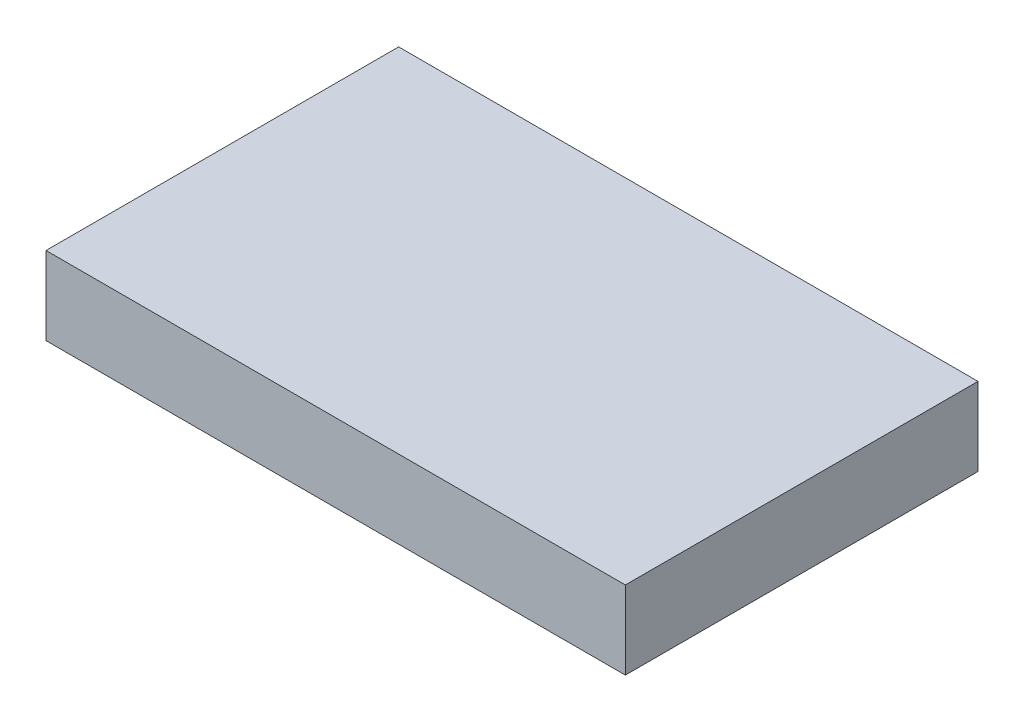
ISO-10303-21;
HEADER;
FILE_DESCRIPTION(('STEP AP214'),'2;1');
FILE_NAME('part.step','',(''),(''),'','','');
FILE_SCHEMA(('AUTOMOTIVE_DESIGN { 1 0 10303 214 1 1 1 1 }'));
ENDSEC;
DATA;
#1=APPLICATION_CONTEXT('core data for automotive mechanical design processes');
#2=APPLICATION_PROTOCOL_DEFINITION('international standard','automotive_design',2000,#1);
#3=PRODUCT_CONTEXT('',#1,'mechanical');
#4=PRODUCT('Part','Part','',(#3));
#5=PRODUCT_RELATED_PRODUCT_CATEGORY('part','',(#4));
#6=PRODUCT_DEFINITION_FORMATION('','',#4);
#7=PRODUCT_DEFINITION_CONTEXT('part definition',#1,'design');
#8=PRODUCT_DEFINITION('design','',#6,#7);
#9=PRODUCT_DEFINITION_SHAPE('','',#8);
#10=(LENGTH_UNIT() NAMED_UNIT(*) SI_UNIT(.MILLI.,.METRE.));
#11=(NAMED_UNIT(*) PLANE_ANGLE_UNIT() SI_UNIT($,.RADIAN.));
#12=(NAMED_UNIT(*) SI_UNIT($,.STERADIAN.) SOLID_ANGLE_UNIT());
#13=UNCERTAINTY_MEASURE_WITH_UNIT(LENGTH_MEASURE(1.E-05),#10,'distance_accuracy_value','');
#14=(GEOMETRIC_REPRESENTATION_CONTEXT(3) GLOBAL_UNCERTAINTY_ASSIGNED_CONTEXT((#13)) GLOBAL_UNIT_ASSIGNED_CONTEXT((#10,
#11,#12)) REPRESENTATION_CONTEXT('',''));
#15=CARTESIAN_POINT('',(0.,0.,0.));
#16=DIRECTION('',(0.,0.,1.));
#17=DIRECTION('',(1.,0.,0.));
#18=AXIS2_PLACEMENT_3D('',#15,#16,#17);
#19=CARTESIAN_POINT('',(-57.5,15.5,-35.01));
#20=DIRECTION('',(0.,-1.,0.));
#21=DIRECTION('',(0.,0.,-1.));
#22=AXIS2_PLACEMENT_3D('',#19,#20,#21);
#23=PLANE('',#22);
#24=DIRECTION('',(0.,0.,-1.));
#25=VECTOR('',#24,1.);
#26=CARTESIAN_POINT('',(-54.5,15.5,-35.));
#27=LINE('',#26,#25);
#28=CARTESIAN_POINT('',(-54.5,15.5,32.));
#29=VERTEX_POINT('',#28);
#30=CARTESIAN_POINT('',(-54.5,15.5,-32.));
#31=VERTEX_POINT('',#30);
#32=EDGE_CURVE('E132',#29,#31,#27,.T.);
#33=ORIENTED_EDGE('',*,*,#32,.F.);
#34=DIRECTION('',(-1.,0.,0.));
#35=VECTOR('',#34,1.);
#36=CARTESIAN_POINT('',(-57.5,15.5,32.));
#37=LINE('',#36,#35);
#38=CARTESIAN_POINT('',(54.5,15.5,32.));
#39=VERTEX_POINT('',#38);
#40=EDGE_CURVE('E129',#39,#29,#37,.T.);
#41=ORIENTED_EDGE('',*,*,#40,.F.);
#42=DIRECTION('',(0.,0.,1.));
#43=VECTOR('',#42,1.);
#44=CARTESIAN_POINT('',(54.5,15.5,-35.));
#45=LINE('',#44,#43);
#46=CARTESIAN_POINT('',(54.5,15.5,-32.));
#47=VERTEX_POINT('',#46);
#48=EDGE_CURVE('E50',#47,#39,#45,.T.);
#49=ORIENTED_EDGE('',*,*,#48,.F.);
#50=DIRECTION('',(1.,0.,0.));
#51=VECTOR('',#50,1.);
#52=CARTESIAN_POINT('',(-57.5,15.5,-32.));
#53=LINE('',#52,#51);
#54=EDGE_CURVE('E117',#31,#47,#53,.T.);
#55=ORIENTED_EDGE('',*,*,#54,.F.);
#56=EDGE_LOOP('',(#33,#41,#49,#55));
#57=FACE_BOUND('',#56,.T.);
#58=DIRECTION('',(0.,0.,-1.));
#59=VECTOR('',#58,1.);
#60=CARTESIAN_POINT('',(-57.5,15.5,-35.));
#61=LINE('',#60,#59);
#62=CARTESIAN_POINT('',(-57.5,15.5,35.));
#63=VERTEX_POINT('',#62);
#64=CARTESIAN_POINT('',(-57.5,15.5,-35.));
#65=VERTEX_POINT('',#64);
#66=EDGE_CURVE('E148',#63,#65,#61,.T.);
#67=ORIENTED_EDGE('',*,*,#66,.T.);
#68=DIRECTION('',(1.,0.,0.));
#69=VECTOR('',#68,1.);
#70=CARTESIAN_POINT('',(-57.5,15.5,-35.));
#71=LINE('',#70,#69);
#72=CARTESIAN_POINT('',(57.5,15.5,-35.));
#73=VERTEX_POINT('',#72);
#74=EDGE_CURVE('E145',#65,#73,#71,.T.);
#75=ORIENTED_EDGE('',*,*,#74,.T.);
#76=DIRECTION('',(0.,0.,1.));
#77=VECTOR('',#76,1.);
#78=CARTESIAN_POINT('',(57.5,15.5,-35.));
#79=LINE('',#78,#77);
#80=CARTESIAN_POINT('',(57.5,15.5,35.));
#81=VERTEX_POINT('',#80);
#82=EDGE_CURVE('E141',#73,#81,#79,.T.);
#83=ORIENTED_EDGE('',*,*,#82,.T.);
#84=DIRECTION('',(-1.,0.,0.));
#85=VECTOR('',#84,1.);
#86=CARTESIAN_POINT('',(-57.5,15.5,35.));
#87=LINE('',#86,#85);
#88=EDGE_CURVE('E113',#81,#63,#87,.T.);
#89=ORIENTED_EDGE('',*,*,#88,.T.);
#90=EDGE_LOOP('',(#67,#75,#83,#89));
#91=FACE_BOUND('',#90,.T.);
#92=ADVANCED_FACE('F33',(#57,#91),#23,.T.);
#93=CARTESIAN_POINT('',(57.5,31.,-35.));
#94=DIRECTION('',(-1.,0.,0.));
#95=DIRECTION('',(0.,0.,1.));
#96=AXIS2_PLACEMENT_3D('',#93,#94,#95);
#97=PLANE('',#96);
#98=ORIENTED_EDGE('',*,*,#82,.F.);
#99=DIRECTION('',(0.,-1.,0.));
#100=VECTOR('',#99,1.);
#101=CARTESIAN_POINT('',(57.5,31.,-35.));
#102=LINE('',#101,#100);
#103=CARTESIAN_POINT('',(57.5,31.,-35.));
#104=VERTEX_POINT('',#103);
#105=EDGE_CURVE('E144',#104,#73,#102,.T.);
#106=ORIENTED_EDGE('',*,*,#105,.F.);
#107=DIRECTION('',(0.,0.,-1.));
#108=VECTOR('',#107,1.);
#109=CARTESIAN_POINT('',(57.5,31.,-35.));
#110=LINE('',#109,#108);
#111=CARTESIAN_POINT('',(57.5,31.,35.));
#112=VERTEX_POINT('',#111);
#113=EDGE_CURVE('E11',#112,#104,#110,.T.);
#114=ORIENTED_EDGE('',*,*,#113,.F.);
#115=DIRECTION('',(0.,-1.,0.));
#116=VECTOR('',#115,1.);
#117=CARTESIAN_POINT('',(57.5,31.,35.));
#118=LINE('',#117,#116);
#119=EDGE_CURVE('E37',#112,#81,#118,.T.);
#120=ORIENTED_EDGE('',*,*,#119,.T.);
#121=EDGE_LOOP('',(#98,#106,#114,#120));
#122=FACE_BOUND('',#121,.T.);
#123=ADVANCED_FACE('F165',(#122),#97,.F.);
#124=CARTESIAN_POINT('',(-57.5,31.,-35.));
#125=DIRECTION('',(0.,0.,1.));
#126=DIRECTION('',(1.,0.,0.));
#127=AXIS2_PLACEMENT_3D('',#124,#125,#126);
#128=PLANE('',#127);
#129=ORIENTED_EDGE('',*,*,#74,.F.);
#130=DIRECTION('',(0.,-1.,0.));
#131=VECTOR('',#130,1.);
#132=CARTESIAN_POINT('',(-57.5,31.,-35.));
#133=LINE('',#132,#131);
#134=CARTESIAN_POINT('',(-57.5,31.,-35.));
#135=VERTEX_POINT('',#134);
#136=EDGE_CURVE('E154',#135,#65,#133,.T.);
#137=ORIENTED_EDGE('',*,*,#136,.F.);
#138=DIRECTION('',(-1.,0.,0.));
#139=VECTOR('',#138,1.);
#140=CARTESIAN_POINT('',(-57.5,31.,-35.));
#141=LINE('',#140,#139);
#142=EDGE_CURVE('E42',#104,#135,#141,.T.);
#143=ORIENTED_EDGE('',*,*,#142,.F.);
#144=ORIENTED_EDGE('',*,*,#105,.T.);
#145=EDGE_LOOP('',(#129,#137,#143,#144));
#146=FACE_BOUND('',#145,.T.);
#147=ADVANCED_FACE('F178',(#146),#128,.F.);
#148=CARTESIAN_POINT('',(-57.5,31.,-35.));
#149=DIRECTION('',(1.,0.,0.));
#150=DIRECTION('',(0.,0.,-1.));
#151=AXIS2_PLACEMENT_3D('',#148,#149,#150);
#152=PLANE('',#151);
#153=ORIENTED_EDGE('',*,*,#66,.F.);
#154=DIRECTION('',(0.,-1.,0.));
#155=VECTOR('',#154,1.);
#156=CARTESIAN_POINT('',(-57.5,31.,35.));
#157=LINE('',#156,#155);
#158=CARTESIAN_POINT('',(-57.5,31.,35.));
#159=VERTEX_POINT('',#158);
#160=EDGE_CURVE('E155',#159,#63,#157,.T.);
#161=ORIENTED_EDGE('',*,*,#160,.F.);
#162=DIRECTION('',(0.,0.,1.));
#163=VECTOR('',#162,1.);
#164=CARTESIAN_POINT('',(-57.5,31.,-35.));
#165=LINE('',#164,#163);
#166=EDGE_CURVE('E138',#135,#159,#165,.T.);
#167=ORIENTED_EDGE('',*,*,#166,.F.);
#168=ORIENTED_EDGE('',*,*,#136,.T.);
#169=EDGE_LOOP('',(#153,#161,#167,#168));
#170=FACE_BOUND('',#169,.T.);
#171=ADVANCED_FACE('F171',(#170),#152,.F.);
#172=CARTESIAN_POINT('',(-57.5,31.,35.));
#173=DIRECTION('',(0.,0.,-1.));
#174=DIRECTION('',(-1.,0.,0.));
#175=AXIS2_PLACEMENT_3D('',#172,#173,#174);
#176=PLANE('',#175);
#177=ORIENTED_EDGE('',*,*,#88,.F.);
#178=ORIENTED_EDGE('',*,*,#119,.F.);
#179=DIRECTION('',(1.,0.,0.));
#180=VECTOR('',#179,1.);
#181=CARTESIAN_POINT('',(-57.5,31.,35.));
#182=LINE('',#181,#180);
#183=EDGE_CURVE('E136',#159,#112,#182,.T.);
#184=ORIENTED_EDGE('',*,*,#183,.F.);
#185=ORIENTED_EDGE('',*,*,#160,.T.);
#186=EDGE_LOOP('',(#177,#178,#184,#185));
#187=FACE_BOUND('',#186,.T.);
#188=ADVANCED_FACE('F35',(#187),#176,.F.);
#189=CARTESIAN_POINT('',(0.,31.,0.));
#190=DIRECTION('',(0.,1.,0.));
#191=DIRECTION('',(0.,0.,1.));
#192=AXIS2_PLACEMENT_3D('',#189,#190,#191);
#193=PLANE('',#192);
#194=ORIENTED_EDGE('',*,*,#113,.T.);
#195=ORIENTED_EDGE('',*,*,#142,.T.);
#196=ORIENTED_EDGE('',*,*,#166,.T.);
#197=ORIENTED_EDGE('',*,*,#183,.T.);
#198=EDGE_LOOP('',(#194,#195,#196,#197));
#199=FACE_BOUND('',#198,.T.);
#200=ADVANCED_FACE('F170',(#199),#193,.T.);
#201=CARTESIAN_POINT('',(54.5,31.,-35.));
#202=DIRECTION('',(-1.,0.,0.));
#203=DIRECTION('',(0.,0.,1.));
#204=AXIS2_PLACEMENT_3D('',#201,#202,#203);
#205=PLANE('',#204);
#206=ORIENTED_EDGE('',*,*,#48,.T.);
#207=DIRECTION('',(0.,-1.,0.));
#208=VECTOR('',#207,1.);
#209=CARTESIAN_POINT('',(54.5,31.,32.));
#210=LINE('',#209,#208);
#211=CARTESIAN_POINT('',(54.5,28.,32.));
#212=VERTEX_POINT('',#211);
#213=EDGE_CURVE('E112',#212,#39,#210,.T.);
#214=ORIENTED_EDGE('',*,*,#213,.F.);
#215=DIRECTION('',(0.,0.,-1.));
#216=VECTOR('',#215,1.);
#217=CARTESIAN_POINT('',(54.5,28.,-35.));
#218=LINE('',#217,#216);
#219=CARTESIAN_POINT('',(54.5,28.,-32.));
#220=VERTEX_POINT('',#219);
#221=EDGE_CURVE('E103',#212,#220,#218,.T.);
#222=ORIENTED_EDGE('',*,*,#221,.T.);
#223=DIRECTION('',(0.,-1.,0.));
#224=VECTOR('',#223,1.);
#225=CARTESIAN_POINT('',(54.5,31.,-32.));
#226=LINE('',#225,#224);
#227=EDGE_CURVE('E110',#220,#47,#226,.T.);
#228=ORIENTED_EDGE('',*,*,#227,.T.);
#229=EDGE_LOOP('',(#206,#214,#222,#228));
#230=FACE_BOUND('',#229,.T.);
#231=ADVANCED_FACE('F109',(#230),#205,.T.);
#232=CARTESIAN_POINT('',(-57.5,31.,-32.));
#233=DIRECTION('',(0.,0.,1.));
#234=DIRECTION('',(1.,0.,0.));
#235=AXIS2_PLACEMENT_3D('',#232,#233,#234);
#236=PLANE('',#235);
#237=ORIENTED_EDGE('',*,*,#54,.T.);
#238=ORIENTED_EDGE('',*,*,#227,.F.);
#239=DIRECTION('',(-1.,0.,0.));
#240=VECTOR('',#239,1.);
#241=CARTESIAN_POINT('',(-57.5,28.,-32.));
#242=LINE('',#241,#240);
#243=CARTESIAN_POINT('',(-54.5,28.,-32.));
#244=VERTEX_POINT('',#243);
#245=EDGE_CURVE('E99',#220,#244,#242,.T.);
#246=ORIENTED_EDGE('',*,*,#245,.T.);
#247=DIRECTION('',(0.,-1.,0.));
#248=VECTOR('',#247,1.);
#249=CARTESIAN_POINT('',(-54.5,31.,-32.));
#250=LINE('',#249,#248);
#251=EDGE_CURVE('E118',#244,#31,#250,.T.);
#252=ORIENTED_EDGE('',*,*,#251,.T.);
#253=EDGE_LOOP('',(#237,#238,#246,#252));
#254=FACE_BOUND('',#253,.T.);
#255=ADVANCED_FACE('F115',(#254),#236,.T.);
#256=CARTESIAN_POINT('',(-54.5,31.,-35.));
#257=DIRECTION('',(1.,0.,0.));
#258=DIRECTION('',(0.,0.,-1.));
#259=AXIS2_PLACEMENT_3D('',#256,#257,#258);
#260=PLANE('',#259);
#261=ORIENTED_EDGE('',*,*,#32,.T.);
#262=ORIENTED_EDGE('',*,*,#251,.F.);
#263=DIRECTION('',(0.,0.,1.));
#264=VECTOR('',#263,1.);
#265=CARTESIAN_POINT('',(-54.5,28.,-35.));
#266=LINE('',#265,#264);
#267=CARTESIAN_POINT('',(-54.5,28.,32.));
#268=VERTEX_POINT('',#267);
#269=EDGE_CURVE('E104',#244,#268,#266,.T.);
#270=ORIENTED_EDGE('',*,*,#269,.T.);
#271=DIRECTION('',(0.,-1.,0.));
#272=VECTOR('',#271,1.);
#273=CARTESIAN_POINT('',(-54.5,31.,32.));
#274=LINE('',#273,#272);
#275=EDGE_CURVE('E120',#268,#29,#274,.T.);
#276=ORIENTED_EDGE('',*,*,#275,.T.);
#277=EDGE_LOOP('',(#261,#262,#270,#276));
#278=FACE_BOUND('',#277,.T.);
#279=ADVANCED_FACE('F195',(#278),#260,.T.);
#280=CARTESIAN_POINT('',(-57.5,31.,32.));
#281=DIRECTION('',(0.,0.,-1.));
#282=DIRECTION('',(-1.,0.,0.));
#283=AXIS2_PLACEMENT_3D('',#280,#281,#282);
#284=PLANE('',#283);
#285=ORIENTED_EDGE('',*,*,#40,.T.);
#286=ORIENTED_EDGE('',*,*,#275,.F.);
#287=DIRECTION('',(1.,0.,0.));
#288=VECTOR('',#287,1.);
#289=CARTESIAN_POINT('',(-57.5,28.,32.));
#290=LINE('',#289,#288);
#291=EDGE_CURVE('E124',#268,#212,#290,.T.);
#292=ORIENTED_EDGE('',*,*,#291,.T.);
#293=ORIENTED_EDGE('',*,*,#213,.T.);
#294=EDGE_LOOP('',(#285,#286,#292,#293));
#295=FACE_BOUND('',#294,.T.);
#296=ADVANCED_FACE('F192',(#295),#284,.T.);
#297=CARTESIAN_POINT('',(0.,28.,0.));
#298=DIRECTION('',(0.,1.,0.));
#299=DIRECTION('',(0.,0.,1.));
#300=AXIS2_PLACEMENT_3D('',#297,#298,#299);
#301=PLANE('',#300);
#302=ORIENTED_EDGE('',*,*,#221,.F.);
#303=ORIENTED_EDGE('',*,*,#291,.F.);
#304=ORIENTED_EDGE('',*,*,#269,.F.);
#305=ORIENTED_EDGE('',*,*,#245,.F.);
#306=EDGE_LOOP('',(#302,#303,#304,#305));
#307=FACE_BOUND('',#306,.T.);
#308=ADVANCED_FACE('F101',(#307),#301,.F.);
#309=CLOSED_SHELL('',(#92,#123,#147,#171,#188,#200,#231,#255,#279,#296,#308));
#310=MANIFOLD_SOLID_BREP('B2',#309);
#311=ADVANCED_BREP_SHAPE_REPRESENTATION('',(#18,#310),#14);
#312=SHAPE_DEFINITION_REPRESENTATION(#9,#311);
ENDSEC;
END-ISO-10303-21;
